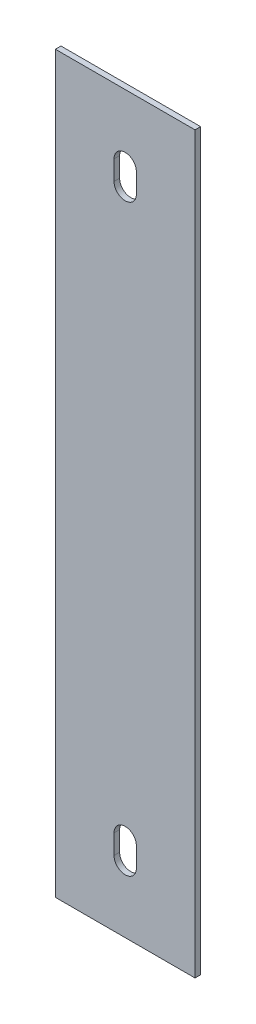
ISO-10303-21;
HEADER;
FILE_DESCRIPTION(('STEP AP214'),'2;1');
FILE_NAME('part.step','',(''),(''),'','','');
FILE_SCHEMA(('AUTOMOTIVE_DESIGN { 1 0 10303 214 1 1 1 1 }'));
ENDSEC;
DATA;
#1=APPLICATION_CONTEXT('core data for automotive mechanical design processes');
#2=APPLICATION_PROTOCOL_DEFINITION('international standard','automotive_design',2000,#1);
#3=PRODUCT_CONTEXT('',#1,'mechanical');
#4=PRODUCT('Part','Part','',(#3));
#5=PRODUCT_RELATED_PRODUCT_CATEGORY('part','',(#4));
#6=PRODUCT_DEFINITION_FORMATION('','',#4);
#7=PRODUCT_DEFINITION_CONTEXT('part definition',#1,'design');
#8=PRODUCT_DEFINITION('design','',#6,#7);
#9=PRODUCT_DEFINITION_SHAPE('','',#8);
#10=(LENGTH_UNIT() NAMED_UNIT(*) SI_UNIT(.MILLI.,.METRE.));
#11=(NAMED_UNIT(*) PLANE_ANGLE_UNIT() SI_UNIT($,.RADIAN.));
#12=(NAMED_UNIT(*) SI_UNIT($,.STERADIAN.) SOLID_ANGLE_UNIT());
#13=UNCERTAINTY_MEASURE_WITH_UNIT(LENGTH_MEASURE(1.E-05),#10,'distance_accuracy_value','');
#14=(GEOMETRIC_REPRESENTATION_CONTEXT(3) GLOBAL_UNCERTAINTY_ASSIGNED_CONTEXT((#13)) GLOBAL_UNIT_ASSIGNED_CONTEXT((#10,
#11,#12)) REPRESENTATION_CONTEXT('',''));
#15=CARTESIAN_POINT('',(0.,0.,0.));
#16=DIRECTION('',(0.,0.,1.));
#17=DIRECTION('',(1.,0.,0.));
#18=AXIS2_PLACEMENT_3D('',#15,#16,#17);
#19=CARTESIAN_POINT('',(-25.,-131.5,2.));
#20=DIRECTION('',(1.,0.,0.));
#21=DIRECTION('',(0.,0.,-1.));
#22=AXIS2_PLACEMENT_3D('',#19,#20,#21);
#23=PLANE('',#22);
#24=DIRECTION('',(0.,-1.,0.));
#25=VECTOR('',#24,1.);
#26=CARTESIAN_POINT('',(-25.,-131.5,0.));
#27=LINE('',#26,#25);
#28=CARTESIAN_POINT('',(-25.,131.5,0.));
#29=VERTEX_POINT('',#28);
#30=CARTESIAN_POINT('',(-25.,-131.5,0.));
#31=VERTEX_POINT('',#30);
#32=EDGE_CURVE('E163',#29,#31,#27,.T.);
#33=ORIENTED_EDGE('',*,*,#32,.T.);
#34=DIRECTION('',(0.,0.,-1.));
#35=VECTOR('',#34,1.);
#36=CARTESIAN_POINT('',(-25.,-131.5,2.));
#37=LINE('',#36,#35);
#38=CARTESIAN_POINT('',(-25.,-131.5,2.));
#39=VERTEX_POINT('',#38);
#40=EDGE_CURVE('E11',#39,#31,#37,.T.);
#41=ORIENTED_EDGE('',*,*,#40,.F.);
#42=DIRECTION('',(0.,-1.,0.));
#43=VECTOR('',#42,1.);
#44=CARTESIAN_POINT('',(-25.,-131.5,2.));
#45=LINE('',#44,#43);
#46=CARTESIAN_POINT('',(-25.,131.5,2.));
#47=VERTEX_POINT('',#46);
#48=EDGE_CURVE('E197',#47,#39,#45,.T.);
#49=ORIENTED_EDGE('',*,*,#48,.F.);
#50=DIRECTION('',(0.,0.,-1.));
#51=VECTOR('',#50,1.);
#52=CARTESIAN_POINT('',(-25.,131.5,2.));
#53=LINE('',#52,#51);
#54=EDGE_CURVE('E207',#47,#29,#53,.T.);
#55=ORIENTED_EDGE('',*,*,#54,.T.);
#56=EDGE_LOOP('',(#33,#41,#49,#55));
#57=FACE_BOUND('',#56,.T.);
#58=ADVANCED_FACE('F39',(#57),#23,.F.);
#59=CARTESIAN_POINT('',(25.,-131.5,2.));
#60=DIRECTION('',(0.,1.,0.));
#61=DIRECTION('',(0.,0.,1.));
#62=AXIS2_PLACEMENT_3D('',#59,#60,#61);
#63=PLANE('',#62);
#64=DIRECTION('',(1.,0.,0.));
#65=VECTOR('',#64,1.);
#66=CARTESIAN_POINT('',(25.,-131.5,0.));
#67=LINE('',#66,#65);
#68=CARTESIAN_POINT('',(25.,-131.5,0.));
#69=VERTEX_POINT('',#68);
#70=EDGE_CURVE('E210',#31,#69,#67,.T.);
#71=ORIENTED_EDGE('',*,*,#70,.T.);
#72=DIRECTION('',(0.,0.,-1.));
#73=VECTOR('',#72,1.);
#74=CARTESIAN_POINT('',(25.,-131.5,2.));
#75=LINE('',#74,#73);
#76=CARTESIAN_POINT('',(25.,-131.5,2.));
#77=VERTEX_POINT('',#76);
#78=EDGE_CURVE('E46',#77,#69,#75,.T.);
#79=ORIENTED_EDGE('',*,*,#78,.F.);
#80=DIRECTION('',(1.,0.,0.));
#81=VECTOR('',#80,1.);
#82=CARTESIAN_POINT('',(25.,-131.5,2.));
#83=LINE('',#82,#81);
#84=EDGE_CURVE('E200',#39,#77,#83,.T.);
#85=ORIENTED_EDGE('',*,*,#84,.F.);
#86=ORIENTED_EDGE('',*,*,#40,.T.);
#87=EDGE_LOOP('',(#71,#79,#85,#86));
#88=FACE_BOUND('',#87,.T.);
#89=ADVANCED_FACE('F239',(#88),#63,.F.);
#90=CARTESIAN_POINT('',(25.,-131.5,2.));
#91=DIRECTION('',(-1.,0.,0.));
#92=DIRECTION('',(0.,0.,1.));
#93=AXIS2_PLACEMENT_3D('',#90,#91,#92);
#94=PLANE('',#93);
#95=DIRECTION('',(0.,1.,0.));
#96=VECTOR('',#95,1.);
#97=CARTESIAN_POINT('',(25.,-131.5,0.));
#98=LINE('',#97,#96);
#99=CARTESIAN_POINT('',(25.,131.5,0.));
#100=VERTEX_POINT('',#99);
#101=EDGE_CURVE('E212',#69,#100,#98,.T.);
#102=ORIENTED_EDGE('',*,*,#101,.T.);
#103=DIRECTION('',(0.,0.,-1.));
#104=VECTOR('',#103,1.);
#105=CARTESIAN_POINT('',(25.,131.5,2.));
#106=LINE('',#105,#104);
#107=CARTESIAN_POINT('',(25.,131.5,2.));
#108=VERTEX_POINT('',#107);
#109=EDGE_CURVE('E217',#108,#100,#106,.T.);
#110=ORIENTED_EDGE('',*,*,#109,.F.);
#111=DIRECTION('',(0.,1.,0.));
#112=VECTOR('',#111,1.);
#113=CARTESIAN_POINT('',(25.,-131.5,2.));
#114=LINE('',#113,#112);
#115=EDGE_CURVE('E203',#77,#108,#114,.T.);
#116=ORIENTED_EDGE('',*,*,#115,.F.);
#117=ORIENTED_EDGE('',*,*,#78,.T.);
#118=EDGE_LOOP('',(#102,#110,#116,#117));
#119=FACE_BOUND('',#118,.T.);
#120=ADVANCED_FACE('F224',(#119),#94,.F.);
#121=CARTESIAN_POINT('',(25.,131.5,2.));
#122=DIRECTION('',(0.,-1.,0.));
#123=DIRECTION('',(1.,0.,0.));
#124=AXIS2_PLACEMENT_3D('',#121,#122,#123);
#125=PLANE('',#124);
#126=DIRECTION('',(-1.,0.,0.));
#127=VECTOR('',#126,1.);
#128=CARTESIAN_POINT('',(25.,131.5,0.));
#129=LINE('',#128,#127);
#130=EDGE_CURVE('E201',#100,#29,#129,.T.);
#131=ORIENTED_EDGE('',*,*,#130,.T.);
#132=ORIENTED_EDGE('',*,*,#54,.F.);
#133=DIRECTION('',(-1.,0.,0.));
#134=VECTOR('',#133,1.);
#135=CARTESIAN_POINT('',(25.,131.5,2.));
#136=LINE('',#135,#134);
#137=EDGE_CURVE('E205',#108,#47,#136,.T.);
#138=ORIENTED_EDGE('',*,*,#137,.F.);
#139=ORIENTED_EDGE('',*,*,#109,.T.);
#140=EDGE_LOOP('',(#131,#132,#138,#139));
#141=FACE_BOUND('',#140,.T.);
#142=ADVANCED_FACE('F232',(#141),#125,.F.);
#143=CARTESIAN_POINT('',(0.,0.,2.));
#144=DIRECTION('',(0.,0.,1.));
#145=DIRECTION('',(1.,0.,0.));
#146=AXIS2_PLACEMENT_3D('',#143,#144,#145);
#147=PLANE('',#146);
#148=CARTESIAN_POINT('',(0.,-108.,2.));
#149=DIRECTION('',(0.,0.,1.));
#150=DIRECTION('',(1.,0.,0.));
#151=AXIS2_PLACEMENT_3D('',#148,#149,#150);
#152=CIRCLE('',#151,4.);
#153=CARTESIAN_POINT('',(-4.,-108.,2.));
#154=VERTEX_POINT('',#153);
#155=CARTESIAN_POINT('',(4.,-108.,2.));
#156=VERTEX_POINT('',#155);
#157=EDGE_CURVE('E53',#154,#156,#152,.T.);
#158=ORIENTED_EDGE('',*,*,#157,.F.);
#159=DIRECTION('',(0.,-1.,0.));
#160=VECTOR('',#159,1.);
#161=CARTESIAN_POINT('',(-4.,-108.,2.));
#162=LINE('',#161,#160);
#163=CARTESIAN_POINT('',(-4.,-101.,2.));
#164=VERTEX_POINT('',#163);
#165=EDGE_CURVE('E148',#164,#154,#162,.T.);
#166=ORIENTED_EDGE('',*,*,#165,.F.);
#167=CARTESIAN_POINT('',(0.,-101.,2.));
#168=DIRECTION('',(0.,0.,1.));
#169=DIRECTION('',(1.,0.,0.));
#170=AXIS2_PLACEMENT_3D('',#167,#168,#169);
#171=CIRCLE('',#170,4.);
#172=CARTESIAN_POINT('',(4.,-101.,2.));
#173=VERTEX_POINT('',#172);
#174=EDGE_CURVE('E151',#173,#164,#171,.T.);
#175=ORIENTED_EDGE('',*,*,#174,.F.);
#176=DIRECTION('',(0.,1.,0.));
#177=VECTOR('',#176,1.);
#178=CARTESIAN_POINT('',(4.,-108.,2.));
#179=LINE('',#178,#177);
#180=EDGE_CURVE('E157',#156,#173,#179,.T.);
#181=ORIENTED_EDGE('',*,*,#180,.F.);
#182=EDGE_LOOP('',(#158,#166,#175,#181));
#183=FACE_BOUND('',#182,.T.);
#184=CARTESIAN_POINT('',(0.,108.,2.));
#185=DIRECTION('',(0.,0.,1.));
#186=DIRECTION('',(-1.,0.,0.));
#187=AXIS2_PLACEMENT_3D('',#184,#185,#186);
#188=CIRCLE('',#187,4.);
#189=CARTESIAN_POINT('',(4.,108.,2.));
#190=VERTEX_POINT('',#189);
#191=CARTESIAN_POINT('',(-4.,108.,2.));
#192=VERTEX_POINT('',#191);
#193=EDGE_CURVE('E61',#190,#192,#188,.T.);
#194=ORIENTED_EDGE('',*,*,#193,.F.);
#195=DIRECTION('',(0.,1.,0.));
#196=VECTOR('',#195,1.);
#197=CARTESIAN_POINT('',(4.,108.,2.));
#198=LINE('',#197,#196);
#199=CARTESIAN_POINT('',(4.,101.,2.));
#200=VERTEX_POINT('',#199);
#201=EDGE_CURVE('E176',#200,#190,#198,.T.);
#202=ORIENTED_EDGE('',*,*,#201,.F.);
#203=CARTESIAN_POINT('',(0.,101.,2.));
#204=DIRECTION('',(0.,0.,1.));
#205=DIRECTION('',(-1.,0.,0.));
#206=AXIS2_PLACEMENT_3D('',#203,#204,#205);
#207=CIRCLE('',#206,4.);
#208=CARTESIAN_POINT('',(-4.,101.,2.));
#209=VERTEX_POINT('',#208);
#210=EDGE_CURVE('E179',#209,#200,#207,.T.);
#211=ORIENTED_EDGE('',*,*,#210,.F.);
#212=DIRECTION('',(0.,-1.,0.));
#213=VECTOR('',#212,1.);
#214=CARTESIAN_POINT('',(-4.,108.,2.));
#215=LINE('',#214,#213);
#216=EDGE_CURVE('E183',#192,#209,#215,.T.);
#217=ORIENTED_EDGE('',*,*,#216,.F.);
#218=EDGE_LOOP('',(#194,#202,#211,#217));
#219=FACE_BOUND('',#218,.T.);
#220=ORIENTED_EDGE('',*,*,#48,.T.);
#221=ORIENTED_EDGE('',*,*,#84,.T.);
#222=ORIENTED_EDGE('',*,*,#115,.T.);
#223=ORIENTED_EDGE('',*,*,#137,.T.);
#224=EDGE_LOOP('',(#220,#221,#222,#223));
#225=FACE_BOUND('',#224,.T.);
#226=ADVANCED_FACE('F238',(#183,#219,#225),#147,.T.);
#227=CARTESIAN_POINT('',(0.,0.,0.));
#228=DIRECTION('',(0.,0.,1.));
#229=DIRECTION('',(1.,0.,0.));
#230=AXIS2_PLACEMENT_3D('',#227,#228,#229);
#231=PLANE('',#230);
#232=DIRECTION('',(0.,-1.,0.));
#233=VECTOR('',#232,1.);
#234=CARTESIAN_POINT('',(-4.,-108.,0.));
#235=LINE('',#234,#233);
#236=CARTESIAN_POINT('',(-4.,-101.,0.));
#237=VERTEX_POINT('',#236);
#238=CARTESIAN_POINT('',(-4.,-108.,0.));
#239=VERTEX_POINT('',#238);
#240=EDGE_CURVE('E135',#237,#239,#235,.T.);
#241=ORIENTED_EDGE('',*,*,#240,.T.);
#242=CARTESIAN_POINT('',(0.,-108.,0.));
#243=DIRECTION('',(0.,0.,1.));
#244=DIRECTION('',(1.,0.,0.));
#245=AXIS2_PLACEMENT_3D('',#242,#243,#244);
#246=CIRCLE('',#245,4.);
#247=CARTESIAN_POINT('',(4.,-108.,0.));
#248=VERTEX_POINT('',#247);
#249=EDGE_CURVE('E129',#239,#248,#246,.T.);
#250=ORIENTED_EDGE('',*,*,#249,.T.);
#251=DIRECTION('',(0.,1.,0.));
#252=VECTOR('',#251,1.);
#253=CARTESIAN_POINT('',(4.,-108.,0.));
#254=LINE('',#253,#252);
#255=CARTESIAN_POINT('',(4.,-101.,0.));
#256=VERTEX_POINT('',#255);
#257=EDGE_CURVE('E139',#248,#256,#254,.T.);
#258=ORIENTED_EDGE('',*,*,#257,.T.);
#259=CARTESIAN_POINT('',(0.,-101.,0.));
#260=DIRECTION('',(0.,0.,1.));
#261=DIRECTION('',(1.,0.,0.));
#262=AXIS2_PLACEMENT_3D('',#259,#260,#261);
#263=CIRCLE('',#262,4.);
#264=EDGE_CURVE('E143',#256,#237,#263,.T.);
#265=ORIENTED_EDGE('',*,*,#264,.T.);
#266=EDGE_LOOP('',(#241,#250,#258,#265));
#267=FACE_BOUND('',#266,.T.);
#268=DIRECTION('',(0.,1.,0.));
#269=VECTOR('',#268,1.);
#270=CARTESIAN_POINT('',(4.,108.,0.));
#271=LINE('',#270,#269);
#272=CARTESIAN_POINT('',(4.,101.,0.));
#273=VERTEX_POINT('',#272);
#274=CARTESIAN_POINT('',(4.,108.,0.));
#275=VERTEX_POINT('',#274);
#276=EDGE_CURVE('E169',#273,#275,#271,.T.);
#277=ORIENTED_EDGE('',*,*,#276,.T.);
#278=CARTESIAN_POINT('',(0.,108.,0.));
#279=DIRECTION('',(0.,0.,1.));
#280=DIRECTION('',(-1.,0.,0.));
#281=AXIS2_PLACEMENT_3D('',#278,#279,#280);
#282=CIRCLE('',#281,4.);
#283=CARTESIAN_POINT('',(-4.,108.,0.));
#284=VERTEX_POINT('',#283);
#285=EDGE_CURVE('E180',#275,#284,#282,.T.);
#286=ORIENTED_EDGE('',*,*,#285,.T.);
#287=DIRECTION('',(0.,-1.,0.));
#288=VECTOR('',#287,1.);
#289=CARTESIAN_POINT('',(-4.,108.,0.));
#290=LINE('',#289,#288);
#291=CARTESIAN_POINT('',(-4.,101.,0.));
#292=VERTEX_POINT('',#291);
#293=EDGE_CURVE('E192',#284,#292,#290,.T.);
#294=ORIENTED_EDGE('',*,*,#293,.T.);
#295=CARTESIAN_POINT('',(0.,101.,0.));
#296=DIRECTION('',(0.,0.,1.));
#297=DIRECTION('',(-1.,0.,0.));
#298=AXIS2_PLACEMENT_3D('',#295,#296,#297);
#299=CIRCLE('',#298,4.);
#300=EDGE_CURVE('E189',#292,#273,#299,.T.);
#301=ORIENTED_EDGE('',*,*,#300,.T.);
#302=EDGE_LOOP('',(#277,#286,#294,#301));
#303=FACE_BOUND('',#302,.T.);
#304=ORIENTED_EDGE('',*,*,#32,.F.);
#305=ORIENTED_EDGE('',*,*,#130,.F.);
#306=ORIENTED_EDGE('',*,*,#101,.F.);
#307=ORIENTED_EDGE('',*,*,#70,.F.);
#308=EDGE_LOOP('',(#304,#305,#306,#307));
#309=FACE_BOUND('',#308,.T.);
#310=ADVANCED_FACE('F145',(#267,#303,#309),#231,.F.);
#311=CARTESIAN_POINT('',(0.,108.,0.));
#312=DIRECTION('',(0.,0.,1.));
#313=DIRECTION('',(1.,0.,0.));
#314=AXIS2_PLACEMENT_3D('',#311,#312,#313);
#315=CYLINDRICAL_SURFACE('',#314,4.);
#316=ORIENTED_EDGE('',*,*,#193,.T.);
#317=DIRECTION('',(0.,0.,1.));
#318=VECTOR('',#317,1.);
#319=CARTESIAN_POINT('',(-4.,108.,0.));
#320=LINE('',#319,#318);
#321=EDGE_CURVE('E167',#284,#192,#320,.T.);
#322=ORIENTED_EDGE('',*,*,#321,.F.);
#323=ORIENTED_EDGE('',*,*,#285,.F.);
#324=DIRECTION('',(0.,0.,1.));
#325=VECTOR('',#324,1.);
#326=CARTESIAN_POINT('',(4.,108.,0.));
#327=LINE('',#326,#325);
#328=EDGE_CURVE('E174',#275,#190,#327,.T.);
#329=ORIENTED_EDGE('',*,*,#328,.T.);
#330=EDGE_LOOP('',(#316,#322,#323,#329));
#331=FACE_BOUND('',#330,.T.);
#332=ADVANCED_FACE('F251',(#331),#315,.F.);
#333=CARTESIAN_POINT('',(4.,108.,0.));
#334=DIRECTION('',(1.,0.,0.));
#335=DIRECTION('',(0.,0.,-1.));
#336=AXIS2_PLACEMENT_3D('',#333,#334,#335);
#337=PLANE('',#336);
#338=ORIENTED_EDGE('',*,*,#201,.T.);
#339=ORIENTED_EDGE('',*,*,#328,.F.);
#340=ORIENTED_EDGE('',*,*,#276,.F.);
#341=DIRECTION('',(0.,0.,1.));
#342=VECTOR('',#341,1.);
#343=CARTESIAN_POINT('',(4.,101.,0.));
#344=LINE('',#343,#342);
#345=EDGE_CURVE('E172',#273,#200,#344,.T.);
#346=ORIENTED_EDGE('',*,*,#345,.T.);
#347=EDGE_LOOP('',(#338,#339,#340,#346));
#348=FACE_BOUND('',#347,.T.);
#349=ADVANCED_FACE('F255',(#348),#337,.F.);
#350=CARTESIAN_POINT('',(0.,101.,0.));
#351=DIRECTION('',(0.,0.,1.));
#352=DIRECTION('',(1.,0.,0.));
#353=AXIS2_PLACEMENT_3D('',#350,#351,#352);
#354=CYLINDRICAL_SURFACE('',#353,4.);
#355=ORIENTED_EDGE('',*,*,#210,.T.);
#356=ORIENTED_EDGE('',*,*,#345,.F.);
#357=ORIENTED_EDGE('',*,*,#300,.F.);
#358=DIRECTION('',(0.,0.,1.));
#359=VECTOR('',#358,1.);
#360=CARTESIAN_POINT('',(-4.,101.,0.));
#361=LINE('',#360,#359);
#362=EDGE_CURVE('E170',#292,#209,#361,.T.);
#363=ORIENTED_EDGE('',*,*,#362,.T.);
#364=EDGE_LOOP('',(#355,#356,#357,#363));
#365=FACE_BOUND('',#364,.T.);
#366=ADVANCED_FACE('F258',(#365),#354,.F.);
#367=CARTESIAN_POINT('',(-4.,108.,0.));
#368=DIRECTION('',(-1.,0.,0.));
#369=DIRECTION('',(0.,0.,1.));
#370=AXIS2_PLACEMENT_3D('',#367,#368,#369);
#371=PLANE('',#370);
#372=ORIENTED_EDGE('',*,*,#216,.T.);
#373=ORIENTED_EDGE('',*,*,#362,.F.);
#374=ORIENTED_EDGE('',*,*,#293,.F.);
#375=ORIENTED_EDGE('',*,*,#321,.T.);
#376=EDGE_LOOP('',(#372,#373,#374,#375));
#377=FACE_BOUND('',#376,.T.);
#378=ADVANCED_FACE('F262',(#377),#371,.F.);
#379=CARTESIAN_POINT('',(0.,-108.,0.));
#380=DIRECTION('',(0.,0.,1.));
#381=DIRECTION('',(1.,0.,0.));
#382=AXIS2_PLACEMENT_3D('',#379,#380,#381);
#383=CYLINDRICAL_SURFACE('',#382,4.);
#384=ORIENTED_EDGE('',*,*,#157,.T.);
#385=DIRECTION('',(0.,0.,1.));
#386=VECTOR('',#385,1.);
#387=CARTESIAN_POINT('',(4.,-108.,0.));
#388=LINE('',#387,#386);
#389=EDGE_CURVE('E125',#248,#156,#388,.T.);
#390=ORIENTED_EDGE('',*,*,#389,.F.);
#391=ORIENTED_EDGE('',*,*,#249,.F.);
#392=DIRECTION('',(0.,0.,1.));
#393=VECTOR('',#392,1.);
#394=CARTESIAN_POINT('',(-4.,-108.,0.));
#395=LINE('',#394,#393);
#396=EDGE_CURVE('E161',#239,#154,#395,.T.);
#397=ORIENTED_EDGE('',*,*,#396,.T.);
#398=EDGE_LOOP('',(#384,#390,#391,#397));
#399=FACE_BOUND('',#398,.T.);
#400=ADVANCED_FACE('F127',(#399),#383,.F.);
#401=CARTESIAN_POINT('',(-4.,-108.,0.));
#402=DIRECTION('',(-1.,0.,0.));
#403=DIRECTION('',(0.,0.,1.));
#404=AXIS2_PLACEMENT_3D('',#401,#402,#403);
#405=PLANE('',#404);
#406=ORIENTED_EDGE('',*,*,#165,.T.);
#407=ORIENTED_EDGE('',*,*,#396,.F.);
#408=ORIENTED_EDGE('',*,*,#240,.F.);
#409=DIRECTION('',(0.,0.,1.));
#410=VECTOR('',#409,1.);
#411=CARTESIAN_POINT('',(-4.,-101.,0.));
#412=LINE('',#411,#410);
#413=EDGE_CURVE('E164',#237,#164,#412,.T.);
#414=ORIENTED_EDGE('',*,*,#413,.T.);
#415=EDGE_LOOP('',(#406,#407,#408,#414));
#416=FACE_BOUND('',#415,.T.);
#417=ADVANCED_FACE('F271',(#416),#405,.F.);
#418=CARTESIAN_POINT('',(0.,-101.,0.));
#419=DIRECTION('',(0.,0.,1.));
#420=DIRECTION('',(1.,0.,0.));
#421=AXIS2_PLACEMENT_3D('',#418,#419,#420);
#422=CYLINDRICAL_SURFACE('',#421,4.);
#423=ORIENTED_EDGE('',*,*,#174,.T.);
#424=ORIENTED_EDGE('',*,*,#413,.F.);
#425=ORIENTED_EDGE('',*,*,#264,.F.);
#426=DIRECTION('',(0.,0.,1.));
#427=VECTOR('',#426,1.);
#428=CARTESIAN_POINT('',(4.,-101.,0.));
#429=LINE('',#428,#427);
#430=EDGE_CURVE('E134',#256,#173,#429,.T.);
#431=ORIENTED_EDGE('',*,*,#430,.T.);
#432=EDGE_LOOP('',(#423,#424,#425,#431));
#433=FACE_BOUND('',#432,.T.);
#434=ADVANCED_FACE('F274',(#433),#422,.F.);
#435=CARTESIAN_POINT('',(4.,-108.,0.));
#436=DIRECTION('',(1.,0.,0.));
#437=DIRECTION('',(0.,0.,-1.));
#438=AXIS2_PLACEMENT_3D('',#435,#436,#437);
#439=PLANE('',#438);
#440=ORIENTED_EDGE('',*,*,#180,.T.);
#441=ORIENTED_EDGE('',*,*,#430,.F.);
#442=ORIENTED_EDGE('',*,*,#257,.F.);
#443=ORIENTED_EDGE('',*,*,#389,.T.);
#444=EDGE_LOOP('',(#440,#441,#442,#443));
#445=FACE_BOUND('',#444,.T.);
#446=ADVANCED_FACE('F140',(#445),#439,.F.);
#447=CLOSED_SHELL('',(#58,#89,#120,#142,#226,#310,#332,#349,#366,#378,#400,#417,#434,#446));
#448=MANIFOLD_SOLID_BREP('B2',#447);
#449=ADVANCED_BREP_SHAPE_REPRESENTATION('',(#18,#448),#14);
#450=SHAPE_DEFINITION_REPRESENTATION(#9,#449);
ENDSEC;
END-ISO-10303-21;
